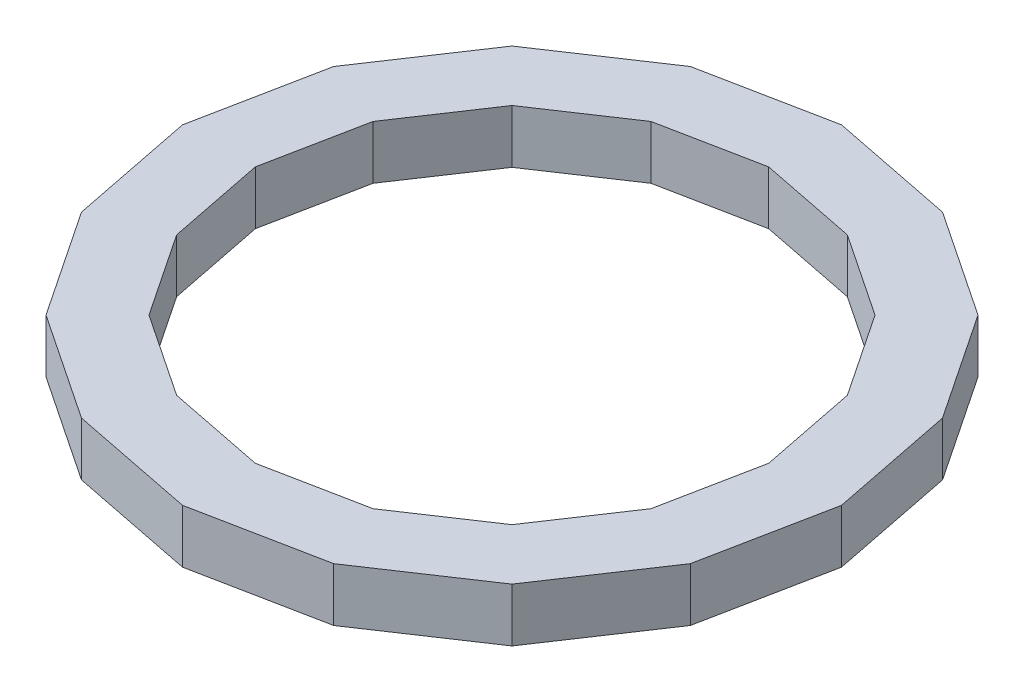
ISO-10303-21;
HEADER;
FILE_DESCRIPTION(('STEP AP214'),'2;1');
FILE_NAME('part.step','',(''),(''),'','','');
FILE_SCHEMA(('AUTOMOTIVE_DESIGN { 1 0 10303 214 1 1 1 1 }'));
ENDSEC;
DATA;
#1=APPLICATION_CONTEXT('core data for automotive mechanical design processes');
#2=APPLICATION_PROTOCOL_DEFINITION('international standard','automotive_design',2000,#1);
#3=PRODUCT_CONTEXT('',#1,'mechanical');
#4=PRODUCT('Part','Part','',(#3));
#5=PRODUCT_RELATED_PRODUCT_CATEGORY('part','',(#4));
#6=PRODUCT_DEFINITION_FORMATION('','',#4);
#7=PRODUCT_DEFINITION_CONTEXT('part definition',#1,'design');
#8=PRODUCT_DEFINITION('design','',#6,#7);
#9=PRODUCT_DEFINITION_SHAPE('','',#8);
#10=(LENGTH_UNIT() NAMED_UNIT(*) SI_UNIT(.MILLI.,.METRE.));
#11=(NAMED_UNIT(*) PLANE_ANGLE_UNIT() SI_UNIT($,.RADIAN.));
#12=(NAMED_UNIT(*) SI_UNIT($,.STERADIAN.) SOLID_ANGLE_UNIT());
#13=UNCERTAINTY_MEASURE_WITH_UNIT(LENGTH_MEASURE(1.E-05),#10,'distance_accuracy_value','');
#14=(GEOMETRIC_REPRESENTATION_CONTEXT(3) GLOBAL_UNCERTAINTY_ASSIGNED_CONTEXT((#13)) GLOBAL_UNIT_ASSIGNED_CONTEXT((#10,
#11,#12)) REPRESENTATION_CONTEXT('',''));
#15=CARTESIAN_POINT('',(0.,0.,0.));
#16=DIRECTION('',(0.,0.,1.));
#17=DIRECTION('',(1.,0.,0.));
#18=AXIS2_PLACEMENT_3D('',#15,#16,#17);
#19=CARTESIAN_POINT('',(0.,19.05,0.));
#20=DIRECTION('',(0.,1.,0.));
#21=DIRECTION('',(0.,0.,1.));
#22=AXIS2_PLACEMENT_3D('',#19,#20,#21);
#23=PLANE('',#22);
#24=DIRECTION('',(0.195090322016118,0.,-0.980785280403233));
#25=VECTOR('',#24,1.);
#26=CARTESIAN_POINT('',(108.256964748165,19.05,44.8415030200345));
#27=LINE('',#26,#25);
#28=CARTESIAN_POINT('',(108.256964748165,19.05,44.8415030200345));
#29=VERTEX_POINT('',#28);
#30=CARTESIAN_POINT('',(117.176494270741,19.05,-1.16573713140205E-12));
#31=VERTEX_POINT('',#30);
#32=EDGE_CURVE('E373',#29,#31,#27,.T.);
#33=ORIENTED_EDGE('',*,*,#32,.T.);
#34=DIRECTION('',(-0.195090322016139,0.,-0.980785280403228));
#35=VECTOR('',#34,1.);
#36=CARTESIAN_POINT('',(117.176494270741,19.05,-1.16573713140205E-12));
#37=LINE('',#36,#35);
#38=CARTESIAN_POINT('',(108.256964748164,19.05,-44.8415030200368));
#39=VERTEX_POINT('',#38);
#40=EDGE_CURVE('E376',#31,#39,#37,.T.);
#41=ORIENTED_EDGE('',*,*,#40,.T.);
#42=DIRECTION('',(-0.555570233019611,0.,-0.831469612302539));
#43=VECTOR('',#42,1.);
#44=CARTESIAN_POINT('',(108.256964748164,19.05,-44.8415030200368));
#45=LINE('',#44,#43);
#46=CARTESIAN_POINT('',(82.8562936945071,19.05,-82.8562936945088));
#47=VERTEX_POINT('',#46);
#48=EDGE_CURVE('E380',#39,#47,#45,.T.);
#49=ORIENTED_EDGE('',*,*,#48,.T.);
#50=DIRECTION('',(-0.831469612302551,0.,-0.555570233019593));
#51=VECTOR('',#50,1.);
#52=CARTESIAN_POINT('',(82.8562936945071,19.05,-82.8562936945088));
#53=LINE('',#52,#51);
#54=CARTESIAN_POINT('',(44.8415030200343,19.05,-108.256964748165));
#55=VERTEX_POINT('',#54);
#56=EDGE_CURVE('E382',#47,#55,#53,.T.);
#57=ORIENTED_EDGE('',*,*,#56,.T.);
#58=DIRECTION('',(-0.980785280403233,0.,-0.195090322016118));
#59=VECTOR('',#58,1.);
#60=CARTESIAN_POINT('',(44.8415030200343,19.05,-108.256964748165));
#61=LINE('',#60,#59);
#62=CARTESIAN_POINT('',(-1.28376307266068E-12,19.05,-117.176494270742));
#63=VERTEX_POINT('',#62);
#64=EDGE_CURVE('E384',#55,#63,#61,.T.);
#65=ORIENTED_EDGE('',*,*,#64,.T.);
#66=DIRECTION('',(-0.980785280403228,0.,0.195090322016139));
#67=VECTOR('',#66,1.);
#68=CARTESIAN_POINT('',(-1.28376307266068E-12,19.05,-117.176494270742));
#69=LINE('',#68,#67);
#70=CARTESIAN_POINT('',(-44.8415030200368,19.05,-108.256964748164));
#71=VERTEX_POINT('',#70);
#72=EDGE_CURVE('E386',#63,#71,#69,.T.);
#73=ORIENTED_EDGE('',*,*,#72,.T.);
#74=DIRECTION('',(-0.831469612302539,0.,0.555570233019611));
#75=VECTOR('',#74,1.);
#76=CARTESIAN_POINT('',(-44.8415030200368,19.05,-108.256964748164));
#77=LINE('',#76,#75);
#78=CARTESIAN_POINT('',(-82.8562936945088,19.05,-82.8562936945071));
#79=VERTEX_POINT('',#78);
#80=EDGE_CURVE('E389',#71,#79,#77,.T.);
#81=ORIENTED_EDGE('',*,*,#80,.T.);
#82=DIRECTION('',(-0.555570233019594,0.,0.831469612302551));
#83=VECTOR('',#82,1.);
#84=CARTESIAN_POINT('',(-82.8562936945088,19.05,-82.8562936945071));
#85=LINE('',#84,#83);
#86=CARTESIAN_POINT('',(-108.256964748165,19.05,-44.8415030200345));
#87=VERTEX_POINT('',#86);
#88=EDGE_CURVE('E392',#79,#87,#85,.T.);
#89=ORIENTED_EDGE('',*,*,#88,.T.);
#90=DIRECTION('',(-0.195090322016118,0.,0.980785280403233));
#91=VECTOR('',#90,1.);
#92=CARTESIAN_POINT('',(-108.256964748165,19.05,-44.8415030200345));
#93=LINE('',#92,#91);
#94=CARTESIAN_POINT('',(-117.176494270742,19.05,1.24933905912237E-12));
#95=VERTEX_POINT('',#94);
#96=EDGE_CURVE('E394',#87,#95,#93,.T.);
#97=ORIENTED_EDGE('',*,*,#96,.T.);
#98=DIRECTION('',(0.195090322016139,0.,0.980785280403228));
#99=VECTOR('',#98,1.);
#100=CARTESIAN_POINT('',(-117.176494270742,19.05,1.24933905912237E-12));
#101=LINE('',#100,#99);
#102=CARTESIAN_POINT('',(-108.256964748164,19.05,44.8415030200367));
#103=VERTEX_POINT('',#102);
#104=EDGE_CURVE('E396',#95,#103,#101,.T.);
#105=ORIENTED_EDGE('',*,*,#104,.T.);
#106=DIRECTION('',(0.555570233019611,0.,0.831469612302539));
#107=VECTOR('',#106,1.);
#108=CARTESIAN_POINT('',(-108.256964748164,19.05,44.8415030200367));
#109=LINE('',#108,#107);
#110=CARTESIAN_POINT('',(-82.8562936945071,19.05,82.8562936945088));
#111=VERTEX_POINT('',#110);
#112=EDGE_CURVE('E399',#103,#111,#109,.T.);
#113=ORIENTED_EDGE('',*,*,#112,.T.);
#114=DIRECTION('',(0.831469612302551,0.,0.555570233019593));
#115=VECTOR('',#114,1.);
#116=CARTESIAN_POINT('',(-82.8562936945071,19.05,82.8562936945088));
#117=LINE('',#116,#115);
#118=CARTESIAN_POINT('',(-44.8415030200345,19.05,108.256964748165));
#119=VERTEX_POINT('',#118);
#120=EDGE_CURVE('E401',#111,#119,#117,.T.);
#121=ORIENTED_EDGE('',*,*,#120,.T.);
#122=DIRECTION('',(0.980785280403233,0.,0.195090322016118));
#123=VECTOR('',#122,1.);
#124=CARTESIAN_POINT('',(-44.8415030200345,19.05,108.256964748165));
#125=LINE('',#124,#123);
#126=CARTESIAN_POINT('',(1.25207224873646E-12,19.05,117.176494270741));
#127=VERTEX_POINT('',#126);
#128=EDGE_CURVE('E403',#119,#127,#125,.T.);
#129=ORIENTED_EDGE('',*,*,#128,.T.);
#130=DIRECTION('',(0.980785280403228,0.,-0.195090322016139));
#131=VECTOR('',#130,1.);
#132=CARTESIAN_POINT('',(1.25207224873646E-12,19.05,117.176494270741));
#133=LINE('',#132,#131);
#134=CARTESIAN_POINT('',(44.8415030200368,19.05,108.256964748164));
#135=VERTEX_POINT('',#134);
#136=EDGE_CURVE('E405',#127,#135,#133,.T.);
#137=ORIENTED_EDGE('',*,*,#136,.T.);
#138=DIRECTION('',(0.831469612302539,0.,-0.555570233019611));
#139=VECTOR('',#138,1.);
#140=CARTESIAN_POINT('',(44.8415030200368,19.05,108.256964748164));
#141=LINE('',#140,#139);
#142=CARTESIAN_POINT('',(82.8562936945088,19.05,82.8562936945071));
#143=VERTEX_POINT('',#142);
#144=EDGE_CURVE('E407',#135,#143,#141,.T.);
#145=ORIENTED_EDGE('',*,*,#144,.T.);
#146=DIRECTION('',(0.555570233019593,0.,-0.831469612302551));
#147=VECTOR('',#146,1.);
#148=CARTESIAN_POINT('',(82.8562936945088,19.05,82.8562936945071));
#149=LINE('',#148,#147);
#150=EDGE_CURVE('E409',#143,#29,#149,.T.);
#151=ORIENTED_EDGE('',*,*,#150,.T.);
#152=EDGE_LOOP('',(#33,#41,#49,#57,#65,#73,#81,#89,#97,#105,#113,#121,#129,#137,#145,#151));
#153=FACE_BOUND('',#152,.T.);
#154=DIRECTION('',(-0.195090322016139,0.,-0.980785280403229));
#155=VECTOR('',#154,1.);
#156=CARTESIAN_POINT('',(91.2788788522502,19.05,-1.02006102449092E-12));
#157=LINE('',#156,#155);
#158=CARTESIAN_POINT('',(91.2788788522502,19.05,-1.02006102449092E-12));
#159=VERTEX_POINT('',#158);
#160=CARTESIAN_POINT('',(84.3306879221709,19.05,-34.9309146616172));
#161=VERTEX_POINT('',#160);
#162=EDGE_CURVE('E252',#159,#161,#157,.T.);
#163=ORIENTED_EDGE('',*,*,#162,.F.);
#164=DIRECTION('',(0.195090322016118,0.,-0.980785280403233));
#165=VECTOR('',#164,1.);
#166=CARTESIAN_POINT('',(84.3306879221716,19.05,34.9309146616153));
#167=LINE('',#166,#165);
#168=CARTESIAN_POINT('',(84.3306879221716,19.05,34.9309146616153));
#169=VERTEX_POINT('',#168);
#170=EDGE_CURVE('E244',#169,#159,#167,.T.);
#171=ORIENTED_EDGE('',*,*,#170,.F.);
#172=DIRECTION('',(0.555570233019593,0.,-0.831469612302551));
#173=VECTOR('',#172,1.);
#174=CARTESIAN_POINT('',(64.5439142155321,19.05,64.5439142155307));
#175=LINE('',#174,#173);
#176=CARTESIAN_POINT('',(64.5439142155321,19.05,64.5439142155307));
#177=VERTEX_POINT('',#176);
#178=EDGE_CURVE('E301',#177,#169,#175,.T.);
#179=ORIENTED_EDGE('',*,*,#178,.F.);
#180=DIRECTION('',(0.831469612302539,0.,-0.555570233019611));
#181=VECTOR('',#180,1.);
#182=CARTESIAN_POINT('',(34.9309146616172,19.05,84.3306879221709));
#183=LINE('',#182,#181);
#184=CARTESIAN_POINT('',(34.9309146616172,19.05,84.3306879221709));
#185=VERTEX_POINT('',#184);
#186=EDGE_CURVE('E299',#185,#177,#183,.T.);
#187=ORIENTED_EDGE('',*,*,#186,.F.);
#188=DIRECTION('',(0.980785280403228,0.,-0.195090322016139));
#189=VECTOR('',#188,1.);
#190=CARTESIAN_POINT('',(9.90300636641187E-13,19.05,91.2788788522501));
#191=LINE('',#190,#189);
#192=CARTESIAN_POINT('',(9.90300636641187E-13,19.05,91.2788788522501));
#193=VERTEX_POINT('',#192);
#194=EDGE_CURVE('E297',#193,#185,#191,.T.);
#195=ORIENTED_EDGE('',*,*,#194,.F.);
#196=DIRECTION('',(0.980785280403233,0.,0.195090322016118));
#197=VECTOR('',#196,1.);
#198=CARTESIAN_POINT('',(-34.9309146616154,19.05,84.3306879221716));
#199=LINE('',#198,#197);
#200=CARTESIAN_POINT('',(-34.9309146616154,19.05,84.3306879221716));
#201=VERTEX_POINT('',#200);
#202=EDGE_CURVE('E295',#201,#193,#199,.T.);
#203=ORIENTED_EDGE('',*,*,#202,.F.);
#204=DIRECTION('',(0.831469612302551,0.,0.555570233019593));
#205=VECTOR('',#204,1.);
#206=CARTESIAN_POINT('',(-64.5439142155307,19.05,64.5439142155321));
#207=LINE('',#206,#205);
#208=CARTESIAN_POINT('',(-64.5439142155307,19.05,64.5439142155321));
#209=VERTEX_POINT('',#208);
#210=EDGE_CURVE('E293',#209,#201,#207,.T.);
#211=ORIENTED_EDGE('',*,*,#210,.F.);
#212=DIRECTION('',(0.555570233019612,0.,0.831469612302539));
#213=VECTOR('',#212,1.);
#214=CARTESIAN_POINT('',(-84.3306879221709,19.05,34.9309146616171));
#215=LINE('',#214,#213);
#216=CARTESIAN_POINT('',(-84.3306879221709,19.05,34.9309146616171));
#217=VERTEX_POINT('',#216);
#218=EDGE_CURVE('E291',#217,#209,#215,.T.);
#219=ORIENTED_EDGE('',*,*,#218,.F.);
#220=DIRECTION('',(0.195090322016139,0.,0.980785280403228));
#221=VECTOR('',#220,1.);
#222=CARTESIAN_POINT('',(-91.2788788522502,19.05,1.02703137064667E-12));
#223=LINE('',#222,#221);
#224=CARTESIAN_POINT('',(-91.2788788522502,19.05,1.02703137064667E-12));
#225=VERTEX_POINT('',#224);
#226=EDGE_CURVE('E289',#225,#217,#223,.T.);
#227=ORIENTED_EDGE('',*,*,#226,.F.);
#228=DIRECTION('',(-0.195090322016118,0.,0.980785280403233));
#229=VECTOR('',#228,1.);
#230=CARTESIAN_POINT('',(-84.3306879221716,19.05,-34.9309146616153));
#231=LINE('',#230,#229);
#232=CARTESIAN_POINT('',(-84.3306879221716,19.05,-34.9309146616153));
#233=VERTEX_POINT('',#232);
#234=EDGE_CURVE('E287',#233,#225,#231,.T.);
#235=ORIENTED_EDGE('',*,*,#234,.F.);
#236=DIRECTION('',(-0.555570233019593,0.,0.831469612302552));
#237=VECTOR('',#236,1.);
#238=CARTESIAN_POINT('',(-64.5439142155322,19.05,-64.5439142155307));
#239=LINE('',#238,#237);
#240=CARTESIAN_POINT('',(-64.5439142155322,19.05,-64.5439142155307));
#241=VERTEX_POINT('',#240);
#242=EDGE_CURVE('E284',#241,#233,#239,.T.);
#243=ORIENTED_EDGE('',*,*,#242,.F.);
#244=DIRECTION('',(-0.831469612302539,0.,0.555570233019611));
#245=VECTOR('',#244,1.);
#246=CARTESIAN_POINT('',(-34.9309146616172,19.05,-84.3306879221709));
#247=LINE('',#246,#245);
#248=CARTESIAN_POINT('',(-34.9309146616172,19.05,-84.3306879221709));
#249=VERTEX_POINT('',#248);
#250=EDGE_CURVE('E281',#249,#241,#247,.T.);
#251=ORIENTED_EDGE('',*,*,#250,.F.);
#252=DIRECTION('',(-0.980785280403228,0.,0.195090322016139));
#253=VECTOR('',#252,1.);
#254=CARTESIAN_POINT('',(-1.0338820401229E-12,19.05,-91.2788788522501));
#255=LINE('',#254,#253);
#256=CARTESIAN_POINT('',(-1.0338820401229E-12,19.05,-91.2788788522501));
#257=VERTEX_POINT('',#256);
#258=EDGE_CURVE('E279',#257,#249,#255,.T.);
#259=ORIENTED_EDGE('',*,*,#258,.F.);
#260=DIRECTION('',(-0.980785280403233,0.,-0.195090322016117));
#261=VECTOR('',#260,1.);
#262=CARTESIAN_POINT('',(34.9309146616154,19.05,-84.3306879221716));
#263=LINE('',#262,#261);
#264=CARTESIAN_POINT('',(34.9309146616154,19.05,-84.3306879221716));
#265=VERTEX_POINT('',#264);
#266=EDGE_CURVE('E276',#265,#257,#263,.T.);
#267=ORIENTED_EDGE('',*,*,#266,.F.);
#268=DIRECTION('',(-0.831469612302552,0.,-0.555570233019593));
#269=VECTOR('',#268,1.);
#270=CARTESIAN_POINT('',(64.5439142155307,19.05,-64.5439142155321));
#271=LINE('',#270,#269);
#272=CARTESIAN_POINT('',(64.5439142155307,19.05,-64.5439142155321));
#273=VERTEX_POINT('',#272);
#274=EDGE_CURVE('E272',#273,#265,#271,.T.);
#275=ORIENTED_EDGE('',*,*,#274,.F.);
#276=DIRECTION('',(-0.555570233019612,0.,-0.831469612302539));
#277=VECTOR('',#276,1.);
#278=CARTESIAN_POINT('',(84.3306879221709,19.05,-34.9309146616172));
#279=LINE('',#278,#277);
#280=EDGE_CURVE('E265',#161,#273,#279,.T.);
#281=ORIENTED_EDGE('',*,*,#280,.F.);
#282=EDGE_LOOP('',(#163,#171,#179,#187,#195,#203,#211,#219,#227,#235,#243,#251,#259,#267,#275,#281));
#283=FACE_BOUND('',#282,.T.);
#284=ADVANCED_FACE('F35',(#153,#283),#23,.T.);
#285=CARTESIAN_POINT('',(0.,0.,0.));
#286=DIRECTION('',(0.,1.,0.));
#287=DIRECTION('',(0.,0.,1.));
#288=AXIS2_PLACEMENT_3D('',#285,#286,#287);
#289=PLANE('',#288);
#290=DIRECTION('',(0.195090322016118,0.,-0.980785280403233));
#291=VECTOR('',#290,1.);
#292=CARTESIAN_POINT('',(108.256964748165,0.,44.8415030200345));
#293=LINE('',#292,#291);
#294=CARTESIAN_POINT('',(108.256964748165,0.,44.8415030200345));
#295=VERTEX_POINT('',#294);
#296=CARTESIAN_POINT('',(117.176494270741,0.,-1.16573713140205E-12));
#297=VERTEX_POINT('',#296);
#298=EDGE_CURVE('E260',#295,#297,#293,.T.);
#299=ORIENTED_EDGE('',*,*,#298,.F.);
#300=DIRECTION('',(0.555570233019593,0.,-0.831469612302551));
#301=VECTOR('',#300,1.);
#302=CARTESIAN_POINT('',(82.8562936945088,0.,82.8562936945071));
#303=LINE('',#302,#301);
#304=CARTESIAN_POINT('',(82.8562936945088,0.,82.8562936945071));
#305=VERTEX_POINT('',#304);
#306=EDGE_CURVE('E377',#305,#295,#303,.T.);
#307=ORIENTED_EDGE('',*,*,#306,.F.);
#308=DIRECTION('',(0.831469612302539,0.,-0.555570233019611));
#309=VECTOR('',#308,1.);
#310=CARTESIAN_POINT('',(44.8415030200368,0.,108.256964748164));
#311=LINE('',#310,#309);
#312=CARTESIAN_POINT('',(44.8415030200368,0.,108.256964748164));
#313=VERTEX_POINT('',#312);
#314=EDGE_CURVE('E442',#313,#305,#311,.T.);
#315=ORIENTED_EDGE('',*,*,#314,.F.);
#316=DIRECTION('',(0.980785280403228,0.,-0.195090322016139));
#317=VECTOR('',#316,1.);
#318=CARTESIAN_POINT('',(1.25207224873646E-12,0.,117.176494270741));
#319=LINE('',#318,#317);
#320=CARTESIAN_POINT('',(1.25207224873646E-12,0.,117.176494270741));
#321=VERTEX_POINT('',#320);
#322=EDGE_CURVE('E440',#321,#313,#319,.T.);
#323=ORIENTED_EDGE('',*,*,#322,.F.);
#324=DIRECTION('',(0.980785280403233,0.,0.195090322016118));
#325=VECTOR('',#324,1.);
#326=CARTESIAN_POINT('',(-44.8415030200345,0.,108.256964748165));
#327=LINE('',#326,#325);
#328=CARTESIAN_POINT('',(-44.8415030200345,0.,108.256964748165));
#329=VERTEX_POINT('',#328);
#330=EDGE_CURVE('E438',#329,#321,#327,.T.);
#331=ORIENTED_EDGE('',*,*,#330,.F.);
#332=DIRECTION('',(0.831469612302551,0.,0.555570233019593));
#333=VECTOR('',#332,1.);
#334=CARTESIAN_POINT('',(-82.8562936945071,0.,82.8562936945088));
#335=LINE('',#334,#333);
#336=CARTESIAN_POINT('',(-82.8562936945071,0.,82.8562936945088));
#337=VERTEX_POINT('',#336);
#338=EDGE_CURVE('E436',#337,#329,#335,.T.);
#339=ORIENTED_EDGE('',*,*,#338,.F.);
#340=DIRECTION('',(0.555570233019611,0.,0.831469612302539));
#341=VECTOR('',#340,1.);
#342=CARTESIAN_POINT('',(-108.256964748164,0.,44.8415030200367));
#343=LINE('',#342,#341);
#344=CARTESIAN_POINT('',(-108.256964748164,0.,44.8415030200367));
#345=VERTEX_POINT('',#344);
#346=EDGE_CURVE('E434',#345,#337,#343,.T.);
#347=ORIENTED_EDGE('',*,*,#346,.F.);
#348=DIRECTION('',(0.195090322016139,0.,0.980785280403228));
#349=VECTOR('',#348,1.);
#350=CARTESIAN_POINT('',(-117.176494270742,0.,1.24933905912237E-12));
#351=LINE('',#350,#349);
#352=CARTESIAN_POINT('',(-117.176494270742,0.,1.24933905912237E-12));
#353=VERTEX_POINT('',#352);
#354=EDGE_CURVE('E432',#353,#345,#351,.T.);
#355=ORIENTED_EDGE('',*,*,#354,.F.);
#356=DIRECTION('',(-0.195090322016118,0.,0.980785280403233));
#357=VECTOR('',#356,1.);
#358=CARTESIAN_POINT('',(-108.256964748165,0.,-44.8415030200345));
#359=LINE('',#358,#357);
#360=CARTESIAN_POINT('',(-108.256964748165,0.,-44.8415030200345));
#361=VERTEX_POINT('',#360);
#362=EDGE_CURVE('E429',#361,#353,#359,.T.);
#363=ORIENTED_EDGE('',*,*,#362,.F.);
#364=DIRECTION('',(-0.555570233019594,0.,0.831469612302551));
#365=VECTOR('',#364,1.);
#366=CARTESIAN_POINT('',(-82.8562936945088,0.,-82.8562936945071));
#367=LINE('',#366,#365);
#368=CARTESIAN_POINT('',(-82.8562936945088,0.,-82.8562936945071));
#369=VERTEX_POINT('',#368);
#370=EDGE_CURVE('E427',#369,#361,#367,.T.);
#371=ORIENTED_EDGE('',*,*,#370,.F.);
#372=DIRECTION('',(-0.831469612302539,0.,0.555570233019611));
#373=VECTOR('',#372,1.);
#374=CARTESIAN_POINT('',(-44.8415030200368,0.,-108.256964748164));
#375=LINE('',#374,#373);
#376=CARTESIAN_POINT('',(-44.8415030200368,0.,-108.256964748164));
#377=VERTEX_POINT('',#376);
#378=EDGE_CURVE('E425',#377,#369,#375,.T.);
#379=ORIENTED_EDGE('',*,*,#378,.F.);
#380=DIRECTION('',(-0.980785280403228,0.,0.195090322016139));
#381=VECTOR('',#380,1.);
#382=CARTESIAN_POINT('',(-1.28376307266068E-12,0.,-117.176494270742));
#383=LINE('',#382,#381);
#384=CARTESIAN_POINT('',(-1.28376307266068E-12,0.,-117.176494270742));
#385=VERTEX_POINT('',#384);
#386=EDGE_CURVE('E423',#385,#377,#383,.T.);
#387=ORIENTED_EDGE('',*,*,#386,.F.);
#388=DIRECTION('',(-0.980785280403233,0.,-0.195090322016118));
#389=VECTOR('',#388,1.);
#390=CARTESIAN_POINT('',(44.8415030200343,0.,-108.256964748165));
#391=LINE('',#390,#389);
#392=CARTESIAN_POINT('',(44.8415030200343,0.,-108.256964748165));
#393=VERTEX_POINT('',#392);
#394=EDGE_CURVE('E421',#393,#385,#391,.T.);
#395=ORIENTED_EDGE('',*,*,#394,.F.);
#396=DIRECTION('',(-0.831469612302551,0.,-0.555570233019593));
#397=VECTOR('',#396,1.);
#398=CARTESIAN_POINT('',(82.8562936945071,0.,-82.8562936945088));
#399=LINE('',#398,#397);
#400=CARTESIAN_POINT('',(82.8562936945071,0.,-82.8562936945088));
#401=VERTEX_POINT('',#400);
#402=EDGE_CURVE('E419',#401,#393,#399,.T.);
#403=ORIENTED_EDGE('',*,*,#402,.F.);
#404=DIRECTION('',(-0.555570233019611,0.,-0.831469612302539));
#405=VECTOR('',#404,1.);
#406=CARTESIAN_POINT('',(108.256964748164,0.,-44.8415030200368));
#407=LINE('',#406,#405);
#408=CARTESIAN_POINT('',(108.256964748164,0.,-44.8415030200368));
#409=VERTEX_POINT('',#408);
#410=EDGE_CURVE('E417',#409,#401,#407,.T.);
#411=ORIENTED_EDGE('',*,*,#410,.F.);
#412=DIRECTION('',(-0.195090322016139,0.,-0.980785280403228));
#413=VECTOR('',#412,1.);
#414=CARTESIAN_POINT('',(117.176494270741,0.,-1.16573713140205E-12));
#415=LINE('',#414,#413);
#416=EDGE_CURVE('E414',#297,#409,#415,.T.);
#417=ORIENTED_EDGE('',*,*,#416,.F.);
#418=EDGE_LOOP('',(#299,#307,#315,#323,#331,#339,#347,#355,#363,#371,#379,#387,#395,#403,#411,#417));
#419=FACE_BOUND('',#418,.T.);
#420=DIRECTION('',(0.195090322016118,0.,-0.980785280403233));
#421=VECTOR('',#420,1.);
#422=CARTESIAN_POINT('',(84.3306879221716,0.,34.9309146616153));
#423=LINE('',#422,#421);
#424=CARTESIAN_POINT('',(84.3306879221716,0.,34.9309146616153));
#425=VERTEX_POINT('',#424);
#426=CARTESIAN_POINT('',(91.2788788522502,0.,-1.02006102449092E-12));
#427=VERTEX_POINT('',#426);
#428=EDGE_CURVE('E58',#425,#427,#423,.T.);
#429=ORIENTED_EDGE('',*,*,#428,.T.);
#430=DIRECTION('',(-0.195090322016139,0.,-0.980785280403229));
#431=VECTOR('',#430,1.);
#432=CARTESIAN_POINT('',(91.2788788522502,0.,-1.02006102449092E-12));
#433=LINE('',#432,#431);
#434=CARTESIAN_POINT('',(84.3306879221709,0.,-34.9309146616172));
#435=VERTEX_POINT('',#434);
#436=EDGE_CURVE('E259',#427,#435,#433,.T.);
#437=ORIENTED_EDGE('',*,*,#436,.T.);
#438=DIRECTION('',(-0.555570233019612,0.,-0.831469612302539));
#439=VECTOR('',#438,1.);
#440=CARTESIAN_POINT('',(84.3306879221709,0.,-34.9309146616172));
#441=LINE('',#440,#439);
#442=CARTESIAN_POINT('',(64.5439142155307,0.,-64.5439142155321));
#443=VERTEX_POINT('',#442);
#444=EDGE_CURVE('E305',#435,#443,#441,.T.);
#445=ORIENTED_EDGE('',*,*,#444,.T.);
#446=DIRECTION('',(-0.831469612302552,0.,-0.555570233019593));
#447=VECTOR('',#446,1.);
#448=CARTESIAN_POINT('',(64.5439142155307,0.,-64.5439142155321));
#449=LINE('',#448,#447);
#450=CARTESIAN_POINT('',(34.9309146616154,0.,-84.3306879221716));
#451=VERTEX_POINT('',#450);
#452=EDGE_CURVE('E308',#443,#451,#449,.T.);
#453=ORIENTED_EDGE('',*,*,#452,.T.);
#454=DIRECTION('',(-0.980785280403233,0.,-0.195090322016117));
#455=VECTOR('',#454,1.);
#456=CARTESIAN_POINT('',(34.9309146616154,0.,-84.3306879221716));
#457=LINE('',#456,#455);
#458=CARTESIAN_POINT('',(-1.0338820401229E-12,0.,-91.2788788522501));
#459=VERTEX_POINT('',#458);
#460=EDGE_CURVE('E311',#451,#459,#457,.T.);
#461=ORIENTED_EDGE('',*,*,#460,.T.);
#462=DIRECTION('',(-0.980785280403228,0.,0.195090322016139));
#463=VECTOR('',#462,1.);
#464=CARTESIAN_POINT('',(-1.0338820401229E-12,0.,-91.2788788522501));
#465=LINE('',#464,#463);
#466=CARTESIAN_POINT('',(-34.9309146616172,0.,-84.3306879221709));
#467=VERTEX_POINT('',#466);
#468=EDGE_CURVE('E314',#459,#467,#465,.T.);
#469=ORIENTED_EDGE('',*,*,#468,.T.);
#470=DIRECTION('',(-0.831469612302539,0.,0.555570233019611));
#471=VECTOR('',#470,1.);
#472=CARTESIAN_POINT('',(-34.9309146616172,0.,-84.3306879221709));
#473=LINE('',#472,#471);
#474=CARTESIAN_POINT('',(-64.5439142155322,0.,-64.5439142155307));
#475=VERTEX_POINT('',#474);
#476=EDGE_CURVE('E317',#467,#475,#473,.T.);
#477=ORIENTED_EDGE('',*,*,#476,.T.);
#478=DIRECTION('',(-0.555570233019593,0.,0.831469612302552));
#479=VECTOR('',#478,1.);
#480=CARTESIAN_POINT('',(-64.5439142155322,0.,-64.5439142155307));
#481=LINE('',#480,#479);
#482=CARTESIAN_POINT('',(-84.3306879221716,0.,-34.9309146616153));
#483=VERTEX_POINT('',#482);
#484=EDGE_CURVE('E320',#475,#483,#481,.T.);
#485=ORIENTED_EDGE('',*,*,#484,.T.);
#486=DIRECTION('',(-0.195090322016118,0.,0.980785280403233));
#487=VECTOR('',#486,1.);
#488=CARTESIAN_POINT('',(-84.3306879221716,0.,-34.9309146616153));
#489=LINE('',#488,#487);
#490=CARTESIAN_POINT('',(-91.2788788522502,0.,1.02703137064667E-12));
#491=VERTEX_POINT('',#490);
#492=EDGE_CURVE('E323',#483,#491,#489,.T.);
#493=ORIENTED_EDGE('',*,*,#492,.T.);
#494=DIRECTION('',(0.195090322016139,0.,0.980785280403228));
#495=VECTOR('',#494,1.);
#496=CARTESIAN_POINT('',(-91.2788788522502,0.,1.02703137064667E-12));
#497=LINE('',#496,#495);
#498=CARTESIAN_POINT('',(-84.3306879221709,0.,34.9309146616171));
#499=VERTEX_POINT('',#498);
#500=EDGE_CURVE('E326',#491,#499,#497,.T.);
#501=ORIENTED_EDGE('',*,*,#500,.T.);
#502=DIRECTION('',(0.555570233019612,0.,0.831469612302539));
#503=VECTOR('',#502,1.);
#504=CARTESIAN_POINT('',(-84.3306879221709,0.,34.9309146616171));
#505=LINE('',#504,#503);
#506=CARTESIAN_POINT('',(-64.5439142155307,0.,64.5439142155321));
#507=VERTEX_POINT('',#506);
#508=EDGE_CURVE('E329',#499,#507,#505,.T.);
#509=ORIENTED_EDGE('',*,*,#508,.T.);
#510=DIRECTION('',(0.831469612302551,0.,0.555570233019593));
#511=VECTOR('',#510,1.);
#512=CARTESIAN_POINT('',(-64.5439142155307,0.,64.5439142155321));
#513=LINE('',#512,#511);
#514=CARTESIAN_POINT('',(-34.9309146616154,0.,84.3306879221716));
#515=VERTEX_POINT('',#514);
#516=EDGE_CURVE('E332',#507,#515,#513,.T.);
#517=ORIENTED_EDGE('',*,*,#516,.T.);
#518=DIRECTION('',(0.980785280403233,0.,0.195090322016118));
#519=VECTOR('',#518,1.);
#520=CARTESIAN_POINT('',(-34.9309146616154,0.,84.3306879221716));
#521=LINE('',#520,#519);
#522=CARTESIAN_POINT('',(9.90300636641187E-13,0.,91.2788788522501));
#523=VERTEX_POINT('',#522);
#524=EDGE_CURVE('E335',#515,#523,#521,.T.);
#525=ORIENTED_EDGE('',*,*,#524,.T.);
#526=DIRECTION('',(0.980785280403228,0.,-0.195090322016139));
#527=VECTOR('',#526,1.);
#528=CARTESIAN_POINT('',(9.90300636641187E-13,0.,91.2788788522501));
#529=LINE('',#528,#527);
#530=CARTESIAN_POINT('',(34.9309146616172,0.,84.3306879221709));
#531=VERTEX_POINT('',#530);
#532=EDGE_CURVE('E338',#523,#531,#529,.T.);
#533=ORIENTED_EDGE('',*,*,#532,.T.);
#534=DIRECTION('',(0.831469612302539,0.,-0.555570233019611));
#535=VECTOR('',#534,1.);
#536=CARTESIAN_POINT('',(34.9309146616172,0.,84.3306879221709));
#537=LINE('',#536,#535);
#538=CARTESIAN_POINT('',(64.5439142155321,0.,64.5439142155307));
#539=VERTEX_POINT('',#538);
#540=EDGE_CURVE('E341',#531,#539,#537,.T.);
#541=ORIENTED_EDGE('',*,*,#540,.T.);
#542=DIRECTION('',(0.555570233019593,0.,-0.831469612302551));
#543=VECTOR('',#542,1.);
#544=CARTESIAN_POINT('',(64.5439142155321,0.,64.5439142155307));
#545=LINE('',#544,#543);
#546=EDGE_CURVE('E253',#539,#425,#545,.T.);
#547=ORIENTED_EDGE('',*,*,#546,.T.);
#548=EDGE_LOOP('',(#429,#437,#445,#453,#461,#469,#477,#485,#493,#501,#509,#517,#525,#533,#541,#547));
#549=FACE_BOUND('',#548,.T.);
#550=ADVANCED_FACE('F500',(#419,#549),#289,.F.);
#551=CARTESIAN_POINT('',(108.256964748165,19.05,44.8415030200345));
#552=DIRECTION('',(-0.980785280403232,0.,-0.195090322016118));
#553=DIRECTION('',(-0.195090322016118,0.,0.980785280403233));
#554=AXIS2_PLACEMENT_3D('',#551,#552,#553);
#555=PLANE('',#554);
#556=ORIENTED_EDGE('',*,*,#298,.T.);
#557=DIRECTION('',(0.,-1.,0.));
#558=VECTOR('',#557,1.);
#559=CARTESIAN_POINT('',(117.176494270741,19.05,-1.16573713140205E-12));
#560=LINE('',#559,#558);
#561=EDGE_CURVE('E11',#31,#297,#560,.T.);
#562=ORIENTED_EDGE('',*,*,#561,.F.);
#563=ORIENTED_EDGE('',*,*,#32,.F.);
#564=DIRECTION('',(0.,-1.,0.));
#565=VECTOR('',#564,1.);
#566=CARTESIAN_POINT('',(108.256964748165,19.05,44.8415030200345));
#567=LINE('',#566,#565);
#568=EDGE_CURVE('E411',#29,#295,#567,.T.);
#569=ORIENTED_EDGE('',*,*,#568,.T.);
#570=EDGE_LOOP('',(#556,#562,#563,#569));
#571=FACE_BOUND('',#570,.T.);
#572=ADVANCED_FACE('F37',(#571),#555,.F.);
#573=CARTESIAN_POINT('',(117.176494270741,19.05,-1.16573713140205E-12));
#574=DIRECTION('',(-0.980785280403228,0.,0.195090322016139));
#575=DIRECTION('',(0.195090322016139,0.,0.980785280403228));
#576=AXIS2_PLACEMENT_3D('',#573,#574,#575);
#577=PLANE('',#576);
#578=ORIENTED_EDGE('',*,*,#416,.T.);
#579=DIRECTION('',(0.,-1.,0.));
#580=VECTOR('',#579,1.);
#581=CARTESIAN_POINT('',(108.256964748164,19.05,-44.8415030200368));
#582=LINE('',#581,#580);
#583=EDGE_CURVE('E43',#39,#409,#582,.T.);
#584=ORIENTED_EDGE('',*,*,#583,.F.);
#585=ORIENTED_EDGE('',*,*,#40,.F.);
#586=ORIENTED_EDGE('',*,*,#561,.T.);
#587=EDGE_LOOP('',(#578,#584,#585,#586));
#588=FACE_BOUND('',#587,.T.);
#589=ADVANCED_FACE('F517',(#588),#577,.F.);
#590=CARTESIAN_POINT('',(108.256964748164,19.05,-44.8415030200368));
#591=DIRECTION('',(-0.831469612302539,0.,0.555570233019611));
#592=DIRECTION('',(0.555570233019611,0.,0.831469612302539));
#593=AXIS2_PLACEMENT_3D('',#590,#591,#592);
#594=PLANE('',#593);
#595=ORIENTED_EDGE('',*,*,#410,.T.);
#596=DIRECTION('',(0.,-1.,0.));
#597=VECTOR('',#596,1.);
#598=CARTESIAN_POINT('',(82.8562936945071,19.05,-82.8562936945088));
#599=LINE('',#598,#597);
#600=EDGE_CURVE('E487',#47,#401,#599,.T.);
#601=ORIENTED_EDGE('',*,*,#600,.F.);
#602=ORIENTED_EDGE('',*,*,#48,.F.);
#603=ORIENTED_EDGE('',*,*,#583,.T.);
#604=EDGE_LOOP('',(#595,#601,#602,#603));
#605=FACE_BOUND('',#604,.T.);
#606=ADVANCED_FACE('F494',(#605),#594,.F.);
#607=CARTESIAN_POINT('',(82.8562936945071,19.05,-82.8562936945088));
#608=DIRECTION('',(-0.555570233019593,0.,0.831469612302551));
#609=DIRECTION('',(0.831469612302551,0.,0.555570233019593));
#610=AXIS2_PLACEMENT_3D('',#607,#608,#609);
#611=PLANE('',#610);
#612=ORIENTED_EDGE('',*,*,#402,.T.);
#613=DIRECTION('',(0.,-1.,0.));
#614=VECTOR('',#613,1.);
#615=CARTESIAN_POINT('',(44.8415030200343,19.05,-108.256964748165));
#616=LINE('',#615,#614);
#617=EDGE_CURVE('E484',#55,#393,#616,.T.);
#618=ORIENTED_EDGE('',*,*,#617,.F.);
#619=ORIENTED_EDGE('',*,*,#56,.F.);
#620=ORIENTED_EDGE('',*,*,#600,.T.);
#621=EDGE_LOOP('',(#612,#618,#619,#620));
#622=FACE_BOUND('',#621,.T.);
#623=ADVANCED_FACE('F506',(#622),#611,.F.);
#624=CARTESIAN_POINT('',(44.8415030200343,19.05,-108.256964748165));
#625=DIRECTION('',(-0.195090322016118,0.,0.980785280403233));
#626=DIRECTION('',(0.980785280403233,0.,0.195090322016118));
#627=AXIS2_PLACEMENT_3D('',#624,#625,#626);
#628=PLANE('',#627);
#629=ORIENTED_EDGE('',*,*,#394,.T.);
#630=DIRECTION('',(0.,-1.,0.));
#631=VECTOR('',#630,1.);
#632=CARTESIAN_POINT('',(-1.28376307266068E-12,19.05,-117.176494270742));
#633=LINE('',#632,#631);
#634=EDGE_CURVE('E480',#63,#385,#633,.T.);
#635=ORIENTED_EDGE('',*,*,#634,.F.);
#636=ORIENTED_EDGE('',*,*,#64,.F.);
#637=ORIENTED_EDGE('',*,*,#617,.T.);
#638=EDGE_LOOP('',(#629,#635,#636,#637));
#639=FACE_BOUND('',#638,.T.);
#640=ADVANCED_FACE('F510',(#639),#628,.F.);
#641=CARTESIAN_POINT('',(-1.28376307266068E-12,19.05,-117.176494270742));
#642=DIRECTION('',(0.195090322016139,0.,0.980785280403228));
#643=DIRECTION('',(0.980785280403229,0.,-0.195090322016139));
#644=AXIS2_PLACEMENT_3D('',#641,#642,#643);
#645=PLANE('',#644);
#646=ORIENTED_EDGE('',*,*,#386,.T.);
#647=DIRECTION('',(0.,-1.,0.));
#648=VECTOR('',#647,1.);
#649=CARTESIAN_POINT('',(-44.8415030200368,19.05,-108.256964748164));
#650=LINE('',#649,#648);
#651=EDGE_CURVE('E476',#71,#377,#650,.T.);
#652=ORIENTED_EDGE('',*,*,#651,.F.);
#653=ORIENTED_EDGE('',*,*,#72,.F.);
#654=ORIENTED_EDGE('',*,*,#634,.T.);
#655=EDGE_LOOP('',(#646,#652,#653,#654));
#656=FACE_BOUND('',#655,.T.);
#657=ADVANCED_FACE('F570',(#656),#645,.F.);
#658=CARTESIAN_POINT('',(-44.8415030200368,19.05,-108.256964748164));
#659=DIRECTION('',(0.555570233019611,0.,0.831469612302539));
#660=DIRECTION('',(0.831469612302539,0.,-0.555570233019611));
#661=AXIS2_PLACEMENT_3D('',#658,#659,#660);
#662=PLANE('',#661);
#663=ORIENTED_EDGE('',*,*,#378,.T.);
#664=DIRECTION('',(0.,-1.,0.));
#665=VECTOR('',#664,1.);
#666=CARTESIAN_POINT('',(-82.8562936945088,19.05,-82.8562936945071));
#667=LINE('',#666,#665);
#668=EDGE_CURVE('E473',#79,#369,#667,.T.);
#669=ORIENTED_EDGE('',*,*,#668,.F.);
#670=ORIENTED_EDGE('',*,*,#80,.F.);
#671=ORIENTED_EDGE('',*,*,#651,.T.);
#672=EDGE_LOOP('',(#663,#669,#670,#671));
#673=FACE_BOUND('',#672,.T.);
#674=ADVANCED_FACE('F567',(#673),#662,.F.);
#675=CARTESIAN_POINT('',(-82.8562936945088,19.05,-82.8562936945071));
#676=DIRECTION('',(0.831469612302551,0.,0.555570233019593));
#677=DIRECTION('',(0.555570233019593,0.,-0.831469612302551));
#678=AXIS2_PLACEMENT_3D('',#675,#676,#677);
#679=PLANE('',#678);
#680=ORIENTED_EDGE('',*,*,#370,.T.);
#681=DIRECTION('',(0.,-1.,0.));
#682=VECTOR('',#681,1.);
#683=CARTESIAN_POINT('',(-108.256964748165,19.05,-44.8415030200345));
#684=LINE('',#683,#682);
#685=EDGE_CURVE('E469',#87,#361,#684,.T.);
#686=ORIENTED_EDGE('',*,*,#685,.F.);
#687=ORIENTED_EDGE('',*,*,#88,.F.);
#688=ORIENTED_EDGE('',*,*,#668,.T.);
#689=EDGE_LOOP('',(#680,#686,#687,#688));
#690=FACE_BOUND('',#689,.T.);
#691=ADVANCED_FACE('F563',(#690),#679,.F.);
#692=CARTESIAN_POINT('',(-108.256964748165,19.05,-44.8415030200345));
#693=DIRECTION('',(0.980785280403233,0.,0.195090322016118));
#694=DIRECTION('',(0.195090322016118,0.,-0.980785280403233));
#695=AXIS2_PLACEMENT_3D('',#692,#693,#694);
#696=PLANE('',#695);
#697=ORIENTED_EDGE('',*,*,#362,.T.);
#698=DIRECTION('',(0.,-1.,0.));
#699=VECTOR('',#698,1.);
#700=CARTESIAN_POINT('',(-117.176494270742,19.05,1.24933905912237E-12));
#701=LINE('',#700,#699);
#702=EDGE_CURVE('E465',#95,#353,#701,.T.);
#703=ORIENTED_EDGE('',*,*,#702,.F.);
#704=ORIENTED_EDGE('',*,*,#96,.F.);
#705=ORIENTED_EDGE('',*,*,#685,.T.);
#706=EDGE_LOOP('',(#697,#703,#704,#705));
#707=FACE_BOUND('',#706,.T.);
#708=ADVANCED_FACE('F559',(#707),#696,.F.);
#709=CARTESIAN_POINT('',(-117.176494270742,19.05,1.24933905912237E-12));
#710=DIRECTION('',(0.980785280403228,0.,-0.195090322016139));
#711=DIRECTION('',(-0.195090322016139,0.,-0.980785280403229));
#712=AXIS2_PLACEMENT_3D('',#709,#710,#711);
#713=PLANE('',#712);
#714=ORIENTED_EDGE('',*,*,#354,.T.);
#715=DIRECTION('',(0.,-1.,0.));
#716=VECTOR('',#715,1.);
#717=CARTESIAN_POINT('',(-108.256964748164,19.05,44.8415030200367));
#718=LINE('',#717,#716);
#719=EDGE_CURVE('E462',#103,#345,#718,.T.);
#720=ORIENTED_EDGE('',*,*,#719,.F.);
#721=ORIENTED_EDGE('',*,*,#104,.F.);
#722=ORIENTED_EDGE('',*,*,#702,.T.);
#723=EDGE_LOOP('',(#714,#720,#721,#722));
#724=FACE_BOUND('',#723,.T.);
#725=ADVANCED_FACE('F554',(#724),#713,.F.);
#726=CARTESIAN_POINT('',(-108.256964748164,19.05,44.8415030200367));
#727=DIRECTION('',(0.831469612302539,0.,-0.555570233019611));
#728=DIRECTION('',(-0.555570233019611,0.,-0.831469612302539));
#729=AXIS2_PLACEMENT_3D('',#726,#727,#728);
#730=PLANE('',#729);
#731=ORIENTED_EDGE('',*,*,#346,.T.);
#732=DIRECTION('',(0.,-1.,0.));
#733=VECTOR('',#732,1.);
#734=CARTESIAN_POINT('',(-82.8562936945071,19.05,82.8562936945088));
#735=LINE('',#734,#733);
#736=EDGE_CURVE('E459',#111,#337,#735,.T.);
#737=ORIENTED_EDGE('',*,*,#736,.F.);
#738=ORIENTED_EDGE('',*,*,#112,.F.);
#739=ORIENTED_EDGE('',*,*,#719,.T.);
#740=EDGE_LOOP('',(#731,#737,#738,#739));
#741=FACE_BOUND('',#740,.T.);
#742=ADVANCED_FACE('F548',(#741),#730,.F.);
#743=CARTESIAN_POINT('',(-82.8562936945071,19.05,82.8562936945088));
#744=DIRECTION('',(0.555570233019593,0.,-0.831469612302551));
#745=DIRECTION('',(-0.831469612302551,0.,-0.555570233019593));
#746=AXIS2_PLACEMENT_3D('',#743,#744,#745);
#747=PLANE('',#746);
#748=ORIENTED_EDGE('',*,*,#338,.T.);
#749=DIRECTION('',(0.,-1.,0.));
#750=VECTOR('',#749,1.);
#751=CARTESIAN_POINT('',(-44.8415030200345,19.05,108.256964748165));
#752=LINE('',#751,#750);
#753=EDGE_CURVE('E456',#119,#329,#752,.T.);
#754=ORIENTED_EDGE('',*,*,#753,.F.);
#755=ORIENTED_EDGE('',*,*,#120,.F.);
#756=ORIENTED_EDGE('',*,*,#736,.T.);
#757=EDGE_LOOP('',(#748,#754,#755,#756));
#758=FACE_BOUND('',#757,.T.);
#759=ADVANCED_FACE('F544',(#758),#747,.F.);
#760=CARTESIAN_POINT('',(-44.8415030200345,19.05,108.256964748165));
#761=DIRECTION('',(0.195090322016118,0.,-0.980785280403232));
#762=DIRECTION('',(-0.980785280403233,0.,-0.195090322016118));
#763=AXIS2_PLACEMENT_3D('',#760,#761,#762);
#764=PLANE('',#763);
#765=ORIENTED_EDGE('',*,*,#330,.T.);
#766=DIRECTION('',(0.,-1.,0.));
#767=VECTOR('',#766,1.);
#768=CARTESIAN_POINT('',(1.25207224873646E-12,19.05,117.176494270741));
#769=LINE('',#768,#767);
#770=EDGE_CURVE('E453',#127,#321,#769,.T.);
#771=ORIENTED_EDGE('',*,*,#770,.F.);
#772=ORIENTED_EDGE('',*,*,#128,.F.);
#773=ORIENTED_EDGE('',*,*,#753,.T.);
#774=EDGE_LOOP('',(#765,#771,#772,#773));
#775=FACE_BOUND('',#774,.T.);
#776=ADVANCED_FACE('F539',(#775),#764,.F.);
#777=CARTESIAN_POINT('',(1.25207224873646E-12,19.05,117.176494270741));
#778=DIRECTION('',(-0.195090322016139,0.,-0.980785280403228));
#779=DIRECTION('',(-0.980785280403228,0.,0.195090322016139));
#780=AXIS2_PLACEMENT_3D('',#777,#778,#779);
#781=PLANE('',#780);
#782=ORIENTED_EDGE('',*,*,#322,.T.);
#783=DIRECTION('',(0.,-1.,0.));
#784=VECTOR('',#783,1.);
#785=CARTESIAN_POINT('',(44.8415030200368,19.05,108.256964748164));
#786=LINE('',#785,#784);
#787=EDGE_CURVE('E450',#135,#313,#786,.T.);
#788=ORIENTED_EDGE('',*,*,#787,.F.);
#789=ORIENTED_EDGE('',*,*,#136,.F.);
#790=ORIENTED_EDGE('',*,*,#770,.T.);
#791=EDGE_LOOP('',(#782,#788,#789,#790));
#792=FACE_BOUND('',#791,.T.);
#793=ADVANCED_FACE('F533',(#792),#781,.F.);
#794=CARTESIAN_POINT('',(44.8415030200368,19.05,108.256964748164));
#795=DIRECTION('',(-0.555570233019611,0.,-0.831469612302539));
#796=DIRECTION('',(-0.831469612302539,0.,0.555570233019611));
#797=AXIS2_PLACEMENT_3D('',#794,#795,#796);
#798=PLANE('',#797);
#799=ORIENTED_EDGE('',*,*,#314,.T.);
#800=DIRECTION('',(0.,-1.,0.));
#801=VECTOR('',#800,1.);
#802=CARTESIAN_POINT('',(82.8562936945088,19.05,82.8562936945071));
#803=LINE('',#802,#801);
#804=EDGE_CURVE('E447',#143,#305,#803,.T.);
#805=ORIENTED_EDGE('',*,*,#804,.F.);
#806=ORIENTED_EDGE('',*,*,#144,.F.);
#807=ORIENTED_EDGE('',*,*,#787,.T.);
#808=EDGE_LOOP('',(#799,#805,#806,#807));
#809=FACE_BOUND('',#808,.T.);
#810=ADVANCED_FACE('F529',(#809),#798,.F.);
#811=CARTESIAN_POINT('',(82.8562936945088,19.05,82.8562936945071));
#812=DIRECTION('',(-0.831469612302551,0.,-0.555570233019593));
#813=DIRECTION('',(-0.555570233019593,0.,0.831469612302551));
#814=AXIS2_PLACEMENT_3D('',#811,#812,#813);
#815=PLANE('',#814);
#816=ORIENTED_EDGE('',*,*,#306,.T.);
#817=ORIENTED_EDGE('',*,*,#568,.F.);
#818=ORIENTED_EDGE('',*,*,#150,.F.);
#819=ORIENTED_EDGE('',*,*,#804,.T.);
#820=EDGE_LOOP('',(#816,#817,#818,#819));
#821=FACE_BOUND('',#820,.T.);
#822=ADVANCED_FACE('F524',(#821),#815,.F.);
#823=CARTESIAN_POINT('',(84.3306879221716,19.05,34.9309146616153));
#824=DIRECTION('',(-0.980785280403233,0.,-0.195090322016118));
#825=DIRECTION('',(-0.195090322016118,0.,0.980785280403233));
#826=AXIS2_PLACEMENT_3D('',#823,#824,#825);
#827=PLANE('',#826);
#828=ORIENTED_EDGE('',*,*,#428,.F.);
#829=DIRECTION('',(0.,-1.,0.));
#830=VECTOR('',#829,1.);
#831=CARTESIAN_POINT('',(84.3306879221716,19.05,34.9309146616153));
#832=LINE('',#831,#830);
#833=EDGE_CURVE('E248',#169,#425,#832,.T.);
#834=ORIENTED_EDGE('',*,*,#833,.F.);
#835=ORIENTED_EDGE('',*,*,#170,.T.);
#836=DIRECTION('',(0.,-1.,0.));
#837=VECTOR('',#836,1.);
#838=CARTESIAN_POINT('',(91.2788788522502,19.05,-1.02006102449092E-12));
#839=LINE('',#838,#837);
#840=EDGE_CURVE('E247',#159,#427,#839,.T.);
#841=ORIENTED_EDGE('',*,*,#840,.T.);
#842=EDGE_LOOP('',(#828,#834,#835,#841));
#843=FACE_BOUND('',#842,.T.);
#844=ADVANCED_FACE('F246',(#843),#827,.T.);
#845=CARTESIAN_POINT('',(91.2788788522502,19.05,-1.02006102449092E-12));
#846=DIRECTION('',(-0.980785280403228,0.,0.195090322016139));
#847=DIRECTION('',(0.195090322016139,0.,0.980785280403229));
#848=AXIS2_PLACEMENT_3D('',#845,#846,#847);
#849=PLANE('',#848);
#850=ORIENTED_EDGE('',*,*,#436,.F.);
#851=ORIENTED_EDGE('',*,*,#840,.F.);
#852=ORIENTED_EDGE('',*,*,#162,.T.);
#853=DIRECTION('',(0.,-1.,0.));
#854=VECTOR('',#853,1.);
#855=CARTESIAN_POINT('',(84.3306879221709,19.05,-34.9309146616172));
#856=LINE('',#855,#854);
#857=EDGE_CURVE('E261',#161,#435,#856,.T.);
#858=ORIENTED_EDGE('',*,*,#857,.T.);
#859=EDGE_LOOP('',(#850,#851,#852,#858));
#860=FACE_BOUND('',#859,.T.);
#861=ADVANCED_FACE('F256',(#860),#849,.T.);
#862=CARTESIAN_POINT('',(84.3306879221709,19.05,-34.9309146616172));
#863=DIRECTION('',(-0.831469612302539,0.,0.555570233019612));
#864=DIRECTION('',(0.555570233019612,0.,0.831469612302539));
#865=AXIS2_PLACEMENT_3D('',#862,#863,#864);
#866=PLANE('',#865);
#867=ORIENTED_EDGE('',*,*,#444,.F.);
#868=ORIENTED_EDGE('',*,*,#857,.F.);
#869=ORIENTED_EDGE('',*,*,#280,.T.);
#870=DIRECTION('',(0.,-1.,0.));
#871=VECTOR('',#870,1.);
#872=CARTESIAN_POINT('',(64.5439142155307,19.05,-64.5439142155321));
#873=LINE('',#872,#871);
#874=EDGE_CURVE('E370',#273,#443,#873,.T.);
#875=ORIENTED_EDGE('',*,*,#874,.T.);
#876=EDGE_LOOP('',(#867,#868,#869,#875));
#877=FACE_BOUND('',#876,.T.);
#878=ADVANCED_FACE('F652',(#877),#866,.T.);
#879=CARTESIAN_POINT('',(64.5439142155307,19.05,-64.5439142155321));
#880=DIRECTION('',(-0.555570233019593,0.,0.831469612302551));
#881=DIRECTION('',(0.831469612302552,0.,0.555570233019593));
#882=AXIS2_PLACEMENT_3D('',#879,#880,#881);
#883=PLANE('',#882);
#884=ORIENTED_EDGE('',*,*,#452,.F.);
#885=ORIENTED_EDGE('',*,*,#874,.F.);
#886=ORIENTED_EDGE('',*,*,#274,.T.);
#887=DIRECTION('',(0.,-1.,0.));
#888=VECTOR('',#887,1.);
#889=CARTESIAN_POINT('',(34.9309146616154,19.05,-84.3306879221716));
#890=LINE('',#889,#888);
#891=EDGE_CURVE('E368',#265,#451,#890,.T.);
#892=ORIENTED_EDGE('',*,*,#891,.T.);
#893=EDGE_LOOP('',(#884,#885,#886,#892));
#894=FACE_BOUND('',#893,.T.);
#895=ADVANCED_FACE('F658',(#894),#883,.T.);
#896=CARTESIAN_POINT('',(34.9309146616154,19.05,-84.3306879221716));
#897=DIRECTION('',(-0.195090322016117,0.,0.980785280403233));
#898=DIRECTION('',(0.980785280403233,0.,0.195090322016118));
#899=AXIS2_PLACEMENT_3D('',#896,#897,#898);
#900=PLANE('',#899);
#901=ORIENTED_EDGE('',*,*,#460,.F.);
#902=ORIENTED_EDGE('',*,*,#891,.F.);
#903=ORIENTED_EDGE('',*,*,#266,.T.);
#904=DIRECTION('',(0.,-1.,0.));
#905=VECTOR('',#904,1.);
#906=CARTESIAN_POINT('',(-1.0338820401229E-12,19.05,-91.2788788522501));
#907=LINE('',#906,#905);
#908=EDGE_CURVE('E366',#257,#459,#907,.T.);
#909=ORIENTED_EDGE('',*,*,#908,.T.);
#910=EDGE_LOOP('',(#901,#902,#903,#909));
#911=FACE_BOUND('',#910,.T.);
#912=ADVANCED_FACE('F666',(#911),#900,.T.);
#913=CARTESIAN_POINT('',(-1.0338820401229E-12,19.05,-91.2788788522501));
#914=DIRECTION('',(0.195090322016139,0.,0.980785280403228));
#915=DIRECTION('',(0.980785280403228,0.,-0.195090322016139));
#916=AXIS2_PLACEMENT_3D('',#913,#914,#915);
#917=PLANE('',#916);
#918=ORIENTED_EDGE('',*,*,#468,.F.);
#919=ORIENTED_EDGE('',*,*,#908,.F.);
#920=ORIENTED_EDGE('',*,*,#258,.T.);
#921=DIRECTION('',(0.,-1.,0.));
#922=VECTOR('',#921,1.);
#923=CARTESIAN_POINT('',(-34.9309146616172,19.05,-84.3306879221709));
#924=LINE('',#923,#922);
#925=EDGE_CURVE('E364',#249,#467,#924,.T.);
#926=ORIENTED_EDGE('',*,*,#925,.T.);
#927=EDGE_LOOP('',(#918,#919,#920,#926));
#928=FACE_BOUND('',#927,.T.);
#929=ADVANCED_FACE('F674',(#928),#917,.T.);
#930=CARTESIAN_POINT('',(-34.9309146616172,19.05,-84.3306879221709));
#931=DIRECTION('',(0.555570233019612,0.,0.831469612302539));
#932=DIRECTION('',(0.831469612302539,0.,-0.555570233019612));
#933=AXIS2_PLACEMENT_3D('',#930,#931,#932);
#934=PLANE('',#933);
#935=ORIENTED_EDGE('',*,*,#476,.F.);
#936=ORIENTED_EDGE('',*,*,#925,.F.);
#937=ORIENTED_EDGE('',*,*,#250,.T.);
#938=DIRECTION('',(0.,-1.,0.));
#939=VECTOR('',#938,1.);
#940=CARTESIAN_POINT('',(-64.5439142155322,19.05,-64.5439142155307));
#941=LINE('',#940,#939);
#942=EDGE_CURVE('E362',#241,#475,#941,.T.);
#943=ORIENTED_EDGE('',*,*,#942,.T.);
#944=EDGE_LOOP('',(#935,#936,#937,#943));
#945=FACE_BOUND('',#944,.T.);
#946=ADVANCED_FACE('F682',(#945),#934,.T.);
#947=CARTESIAN_POINT('',(-64.5439142155322,19.05,-64.5439142155307));
#948=DIRECTION('',(0.831469612302552,0.,0.555570233019593));
#949=DIRECTION('',(0.555570233019593,0.,-0.831469612302552));
#950=AXIS2_PLACEMENT_3D('',#947,#948,#949);
#951=PLANE('',#950);
#952=ORIENTED_EDGE('',*,*,#484,.F.);
#953=ORIENTED_EDGE('',*,*,#942,.F.);
#954=ORIENTED_EDGE('',*,*,#242,.T.);
#955=DIRECTION('',(0.,-1.,0.));
#956=VECTOR('',#955,1.);
#957=CARTESIAN_POINT('',(-84.3306879221716,19.05,-34.9309146616153));
#958=LINE('',#957,#956);
#959=EDGE_CURVE('E360',#233,#483,#958,.T.);
#960=ORIENTED_EDGE('',*,*,#959,.T.);
#961=EDGE_LOOP('',(#952,#953,#954,#960));
#962=FACE_BOUND('',#961,.T.);
#963=ADVANCED_FACE('F690',(#962),#951,.T.);
#964=CARTESIAN_POINT('',(-84.3306879221716,19.05,-34.9309146616153));
#965=DIRECTION('',(0.980785280403233,0.,0.195090322016118));
#966=DIRECTION('',(0.195090322016118,0.,-0.980785280403233));
#967=AXIS2_PLACEMENT_3D('',#964,#965,#966);
#968=PLANE('',#967);
#969=ORIENTED_EDGE('',*,*,#492,.F.);
#970=ORIENTED_EDGE('',*,*,#959,.F.);
#971=ORIENTED_EDGE('',*,*,#234,.T.);
#972=DIRECTION('',(0.,-1.,0.));
#973=VECTOR('',#972,1.);
#974=CARTESIAN_POINT('',(-91.2788788522502,19.05,1.02703137064667E-12));
#975=LINE('',#974,#973);
#976=EDGE_CURVE('E358',#225,#491,#975,.T.);
#977=ORIENTED_EDGE('',*,*,#976,.T.);
#978=EDGE_LOOP('',(#969,#970,#971,#977));
#979=FACE_BOUND('',#978,.T.);
#980=ADVANCED_FACE('F698',(#979),#968,.T.);
#981=CARTESIAN_POINT('',(-91.2788788522502,19.05,1.02703137064667E-12));
#982=DIRECTION('',(0.980785280403228,0.,-0.195090322016139));
#983=DIRECTION('',(-0.195090322016139,0.,-0.980785280403228));
#984=AXIS2_PLACEMENT_3D('',#981,#982,#983);
#985=PLANE('',#984);
#986=ORIENTED_EDGE('',*,*,#500,.F.);
#987=ORIENTED_EDGE('',*,*,#976,.F.);
#988=ORIENTED_EDGE('',*,*,#226,.T.);
#989=DIRECTION('',(0.,-1.,0.));
#990=VECTOR('',#989,1.);
#991=CARTESIAN_POINT('',(-84.3306879221709,19.05,34.9309146616171));
#992=LINE('',#991,#990);
#993=EDGE_CURVE('E356',#217,#499,#992,.T.);
#994=ORIENTED_EDGE('',*,*,#993,.T.);
#995=EDGE_LOOP('',(#986,#987,#988,#994));
#996=FACE_BOUND('',#995,.T.);
#997=ADVANCED_FACE('F706',(#996),#985,.T.);
#998=CARTESIAN_POINT('',(-84.3306879221709,19.05,34.9309146616171));
#999=DIRECTION('',(0.831469612302539,0.,-0.555570233019612));
#1000=DIRECTION('',(-0.555570233019612,0.,-0.831469612302539));
#1001=AXIS2_PLACEMENT_3D('',#998,#999,#1000);
#1002=PLANE('',#1001);
#1003=ORIENTED_EDGE('',*,*,#508,.F.);
#1004=ORIENTED_EDGE('',*,*,#993,.F.);
#1005=ORIENTED_EDGE('',*,*,#218,.T.);
#1006=DIRECTION('',(0.,-1.,0.));
#1007=VECTOR('',#1006,1.);
#1008=CARTESIAN_POINT('',(-64.5439142155307,19.05,64.5439142155321));
#1009=LINE('',#1008,#1007);
#1010=EDGE_CURVE('E354',#209,#507,#1009,.T.);
#1011=ORIENTED_EDGE('',*,*,#1010,.T.);
#1012=EDGE_LOOP('',(#1003,#1004,#1005,#1011));
#1013=FACE_BOUND('',#1012,.T.);
#1014=ADVANCED_FACE('F714',(#1013),#1002,.T.);
#1015=CARTESIAN_POINT('',(-64.5439142155307,19.05,64.5439142155321));
#1016=DIRECTION('',(0.555570233019593,0.,-0.831469612302551));
#1017=DIRECTION('',(-0.831469612302551,0.,-0.555570233019593));
#1018=AXIS2_PLACEMENT_3D('',#1015,#1016,#1017);
#1019=PLANE('',#1018);
#1020=ORIENTED_EDGE('',*,*,#516,.F.);
#1021=ORIENTED_EDGE('',*,*,#1010,.F.);
#1022=ORIENTED_EDGE('',*,*,#210,.T.);
#1023=DIRECTION('',(0.,-1.,0.));
#1024=VECTOR('',#1023,1.);
#1025=CARTESIAN_POINT('',(-34.9309146616154,19.05,84.3306879221716));
#1026=LINE('',#1025,#1024);
#1027=EDGE_CURVE('E352',#201,#515,#1026,.T.);
#1028=ORIENTED_EDGE('',*,*,#1027,.T.);
#1029=EDGE_LOOP('',(#1020,#1021,#1022,#1028));
#1030=FACE_BOUND('',#1029,.T.);
#1031=ADVANCED_FACE('F722',(#1030),#1019,.T.);
#1032=CARTESIAN_POINT('',(-34.9309146616154,19.05,84.3306879221716));
#1033=DIRECTION('',(0.195090322016118,0.,-0.980785280403233));
#1034=DIRECTION('',(-0.980785280403233,0.,-0.195090322016118));
#1035=AXIS2_PLACEMENT_3D('',#1032,#1033,#1034);
#1036=PLANE('',#1035);
#1037=ORIENTED_EDGE('',*,*,#524,.F.);
#1038=ORIENTED_EDGE('',*,*,#1027,.F.);
#1039=ORIENTED_EDGE('',*,*,#202,.T.);
#1040=DIRECTION('',(0.,-1.,0.));
#1041=VECTOR('',#1040,1.);
#1042=CARTESIAN_POINT('',(9.90300636641187E-13,19.05,91.2788788522501));
#1043=LINE('',#1042,#1041);
#1044=EDGE_CURVE('E350',#193,#523,#1043,.T.);
#1045=ORIENTED_EDGE('',*,*,#1044,.T.);
#1046=EDGE_LOOP('',(#1037,#1038,#1039,#1045));
#1047=FACE_BOUND('',#1046,.T.);
#1048=ADVANCED_FACE('F730',(#1047),#1036,.T.);
#1049=CARTESIAN_POINT('',(9.90300636641187E-13,19.05,91.2788788522501));
#1050=DIRECTION('',(-0.195090322016139,0.,-0.980785280403228));
#1051=DIRECTION('',(-0.980785280403228,0.,0.195090322016139));
#1052=AXIS2_PLACEMENT_3D('',#1049,#1050,#1051);
#1053=PLANE('',#1052);
#1054=ORIENTED_EDGE('',*,*,#532,.F.);
#1055=ORIENTED_EDGE('',*,*,#1044,.F.);
#1056=ORIENTED_EDGE('',*,*,#194,.T.);
#1057=DIRECTION('',(0.,-1.,0.));
#1058=VECTOR('',#1057,1.);
#1059=CARTESIAN_POINT('',(34.9309146616172,19.05,84.3306879221709));
#1060=LINE('',#1059,#1058);
#1061=EDGE_CURVE('E348',#185,#531,#1060,.T.);
#1062=ORIENTED_EDGE('',*,*,#1061,.T.);
#1063=EDGE_LOOP('',(#1054,#1055,#1056,#1062));
#1064=FACE_BOUND('',#1063,.T.);
#1065=ADVANCED_FACE('F738',(#1064),#1053,.T.);
#1066=CARTESIAN_POINT('',(34.9309146616172,19.05,84.3306879221709));
#1067=DIRECTION('',(-0.555570233019611,0.,-0.831469612302539));
#1068=DIRECTION('',(-0.831469612302539,0.,0.555570233019611));
#1069=AXIS2_PLACEMENT_3D('',#1066,#1067,#1068);
#1070=PLANE('',#1069);
#1071=ORIENTED_EDGE('',*,*,#540,.F.);
#1072=ORIENTED_EDGE('',*,*,#1061,.F.);
#1073=ORIENTED_EDGE('',*,*,#186,.T.);
#1074=DIRECTION('',(0.,-1.,0.));
#1075=VECTOR('',#1074,1.);
#1076=CARTESIAN_POINT('',(64.5439142155321,19.05,64.5439142155307));
#1077=LINE('',#1076,#1075);
#1078=EDGE_CURVE('E50',#177,#539,#1077,.T.);
#1079=ORIENTED_EDGE('',*,*,#1078,.T.);
#1080=EDGE_LOOP('',(#1071,#1072,#1073,#1079));
#1081=FACE_BOUND('',#1080,.T.);
#1082=ADVANCED_FACE('F746',(#1081),#1070,.T.);
#1083=CARTESIAN_POINT('',(64.5439142155321,19.05,64.5439142155307));
#1084=DIRECTION('',(-0.831469612302551,0.,-0.555570233019593));
#1085=DIRECTION('',(-0.555570233019593,0.,0.831469612302551));
#1086=AXIS2_PLACEMENT_3D('',#1083,#1084,#1085);
#1087=PLANE('',#1086);
#1088=ORIENTED_EDGE('',*,*,#546,.F.);
#1089=ORIENTED_EDGE('',*,*,#1078,.F.);
#1090=ORIENTED_EDGE('',*,*,#178,.T.);
#1091=ORIENTED_EDGE('',*,*,#833,.T.);
#1092=EDGE_LOOP('',(#1088,#1089,#1090,#1091));
#1093=FACE_BOUND('',#1092,.T.);
#1094=ADVANCED_FACE('F754',(#1093),#1087,.T.);
#1095=CLOSED_SHELL('',(#284,#550,#572,#589,#606,#623,#640,#657,#674,#691,#708,#725,#742,#759,
#776,#793,#810,#822,#844,#861,#878,#895,#912,#929,#946,#963,#980,#997,#1014,#1031,#1048,#1065,
#1082,#1094));
#1096=MANIFOLD_SOLID_BREP('B2',#1095);
#1097=ADVANCED_BREP_SHAPE_REPRESENTATION('',(#18,#1096),#14);
#1098=SHAPE_DEFINITION_REPRESENTATION(#9,#1097);
ENDSEC;
END-ISO-10303-21;
